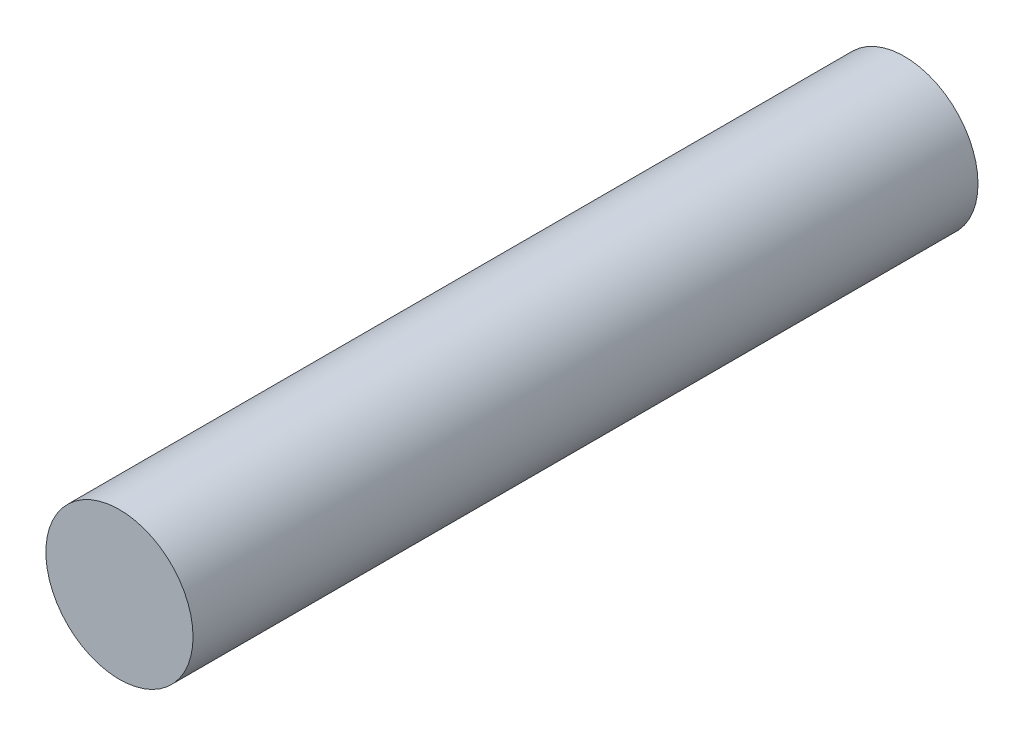
ISO-10303-21;
HEADER;
FILE_DESCRIPTION(('STEP AP214'),'2;1');
FILE_NAME('part.step','',(''),(''),'','','');
FILE_SCHEMA(('AUTOMOTIVE_DESIGN { 1 0 10303 214 1 1 1 1 }'));
ENDSEC;
DATA;
#1=APPLICATION_CONTEXT('core data for automotive mechanical design processes');
#2=APPLICATION_PROTOCOL_DEFINITION('international standard','automotive_design',2000,#1);
#3=PRODUCT_CONTEXT('',#1,'mechanical');
#4=PRODUCT('Part','Part','',(#3));
#5=PRODUCT_RELATED_PRODUCT_CATEGORY('part','',(#4));
#6=PRODUCT_DEFINITION_FORMATION('','',#4);
#7=PRODUCT_DEFINITION_CONTEXT('part definition',#1,'design');
#8=PRODUCT_DEFINITION('design','',#6,#7);
#9=PRODUCT_DEFINITION_SHAPE('','',#8);
#10=(LENGTH_UNIT() NAMED_UNIT(*) SI_UNIT(.MILLI.,.METRE.));
#11=(NAMED_UNIT(*) PLANE_ANGLE_UNIT() SI_UNIT($,.RADIAN.));
#12=(NAMED_UNIT(*) SI_UNIT($,.STERADIAN.) SOLID_ANGLE_UNIT());
#13=UNCERTAINTY_MEASURE_WITH_UNIT(LENGTH_MEASURE(1.E-05),#10,'distance_accuracy_value','');
#14=(GEOMETRIC_REPRESENTATION_CONTEXT(3) GLOBAL_UNCERTAINTY_ASSIGNED_CONTEXT((#13)) GLOBAL_UNIT_ASSIGNED_CONTEXT((#10,
#11,#12)) REPRESENTATION_CONTEXT('',''));
#15=CARTESIAN_POINT('',(0.,0.,0.));
#16=DIRECTION('',(0.,0.,1.));
#17=DIRECTION('',(1.,0.,0.));
#18=AXIS2_PLACEMENT_3D('',#15,#16,#17);
#19=CARTESIAN_POINT('',(0.,0.,203.2));
#20=DIRECTION('',(0.,0.,-1.));
#21=DIRECTION('',(-1.,0.,0.));
#22=AXIS2_PLACEMENT_3D('',#19,#20,#21);
#23=CYLINDRICAL_SURFACE('',#22,38.1);
#24=CARTESIAN_POINT('',(0.,0.,203.2));
#25=DIRECTION('',(0.,0.,1.));
#26=DIRECTION('',(1.,0.,0.));
#27=AXIS2_PLACEMENT_3D('',#24,#25,#26);
#28=CIRCLE('',#27,38.1);
#29=CARTESIAN_POINT('',(38.1,0.,203.2));
#30=VERTEX_POINT('',#29);
#31=EDGE_CURVE('E10',#30,#30,#28,.T.);
#32=ORIENTED_EDGE('',*,*,#31,.F.);
#33=EDGE_LOOP('',(#32));
#34=FACE_BOUND('',#33,.T.);
#35=CARTESIAN_POINT('',(0.,0.,-203.2));
#36=DIRECTION('',(0.,0.,1.));
#37=DIRECTION('',(1.,0.,0.));
#38=AXIS2_PLACEMENT_3D('',#35,#36,#37);
#39=CIRCLE('',#38,38.1);
#40=CARTESIAN_POINT('',(38.1,0.,-203.2));
#41=VERTEX_POINT('',#40);
#42=EDGE_CURVE('E39',#41,#41,#39,.T.);
#43=ORIENTED_EDGE('',*,*,#42,.T.);
#44=EDGE_LOOP('',(#43));
#45=FACE_BOUND('',#44,.T.);
#46=ADVANCED_FACE('F36',(#34,#45),#23,.T.);
#47=CARTESIAN_POINT('',(0.,0.,203.2));
#48=DIRECTION('',(0.,0.,1.));
#49=DIRECTION('',(1.,0.,0.));
#50=AXIS2_PLACEMENT_3D('',#47,#48,#49);
#51=PLANE('',#50);
#52=ORIENTED_EDGE('',*,*,#31,.T.);
#53=EDGE_LOOP('',(#52));
#54=FACE_BOUND('',#53,.T.);
#55=ADVANCED_FACE('F51',(#54),#51,.T.);
#56=CARTESIAN_POINT('',(0.,0.,-203.2));
#57=DIRECTION('',(0.,0.,1.));
#58=DIRECTION('',(1.,0.,0.));
#59=AXIS2_PLACEMENT_3D('',#56,#57,#58);
#60=PLANE('',#59);
#61=ORIENTED_EDGE('',*,*,#42,.F.);
#62=EDGE_LOOP('',(#61));
#63=FACE_BOUND('',#62,.T.);
#64=ADVANCED_FACE('F49',(#63),#60,.F.);
#65=CLOSED_SHELL('',(#46,#55,#64));
#66=MANIFOLD_SOLID_BREP('B2',#65);
#67=ADVANCED_BREP_SHAPE_REPRESENTATION('',(#18,#66),#14);
#68=SHAPE_DEFINITION_REPRESENTATION(#9,#67);
ENDSEC;
END-ISO-10303-21;
